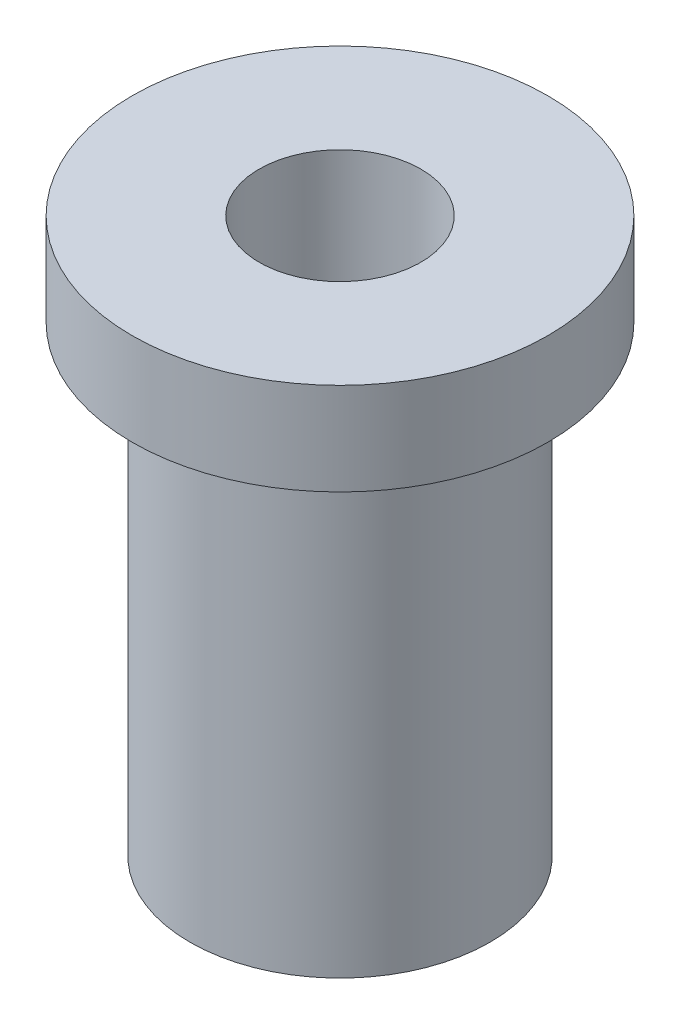
ISO-10303-21;
HEADER;
FILE_DESCRIPTION(('STEP AP214'),'2;1');
FILE_NAME('part.step','',(''),(''),'','','');
FILE_SCHEMA(('AUTOMOTIVE_DESIGN { 1 0 10303 214 1 1 1 1 }'));
ENDSEC;
DATA;
#1=APPLICATION_CONTEXT('core data for automotive mechanical design processes');
#2=APPLICATION_PROTOCOL_DEFINITION('international standard','automotive_design',2000,#1);
#3=PRODUCT_CONTEXT('',#1,'mechanical');
#4=PRODUCT('Part','Part','',(#3));
#5=PRODUCT_RELATED_PRODUCT_CATEGORY('part','',(#4));
#6=PRODUCT_DEFINITION_FORMATION('','',#4);
#7=PRODUCT_DEFINITION_CONTEXT('part definition',#1,'design');
#8=PRODUCT_DEFINITION('design','',#6,#7);
#9=PRODUCT_DEFINITION_SHAPE('','',#8);
#10=(LENGTH_UNIT() NAMED_UNIT(*) SI_UNIT(.MILLI.,.METRE.));
#11=(NAMED_UNIT(*) PLANE_ANGLE_UNIT() SI_UNIT($,.RADIAN.));
#12=(NAMED_UNIT(*) SI_UNIT($,.STERADIAN.) SOLID_ANGLE_UNIT());
#13=UNCERTAINTY_MEASURE_WITH_UNIT(LENGTH_MEASURE(1.E-05),#10,'distance_accuracy_value','');
#14=(GEOMETRIC_REPRESENTATION_CONTEXT(3) GLOBAL_UNCERTAINTY_ASSIGNED_CONTEXT((#13)) GLOBAL_UNIT_ASSIGNED_CONTEXT((#10,
#11,#12)) REPRESENTATION_CONTEXT('',''));
#15=CARTESIAN_POINT('',(0.,0.,0.));
#16=DIRECTION('',(0.,0.,1.));
#17=DIRECTION('',(1.,0.,0.));
#18=AXIS2_PLACEMENT_3D('',#15,#16,#17);
#19=CARTESIAN_POINT('',(0.,12.,0.));
#20=DIRECTION('',(0.,-1.,0.));
#21=DIRECTION('',(0.,0.,-1.));
#22=AXIS2_PLACEMENT_3D('',#19,#20,#21);
#23=CYLINDRICAL_SURFACE('',#22,4.5);
#24=CARTESIAN_POINT('',(0.,12.,0.));
#25=DIRECTION('',(0.,1.,0.));
#26=DIRECTION('',(0.,0.,1.));
#27=AXIS2_PLACEMENT_3D('',#24,#25,#26);
#28=CIRCLE('',#27,4.5);
#29=CARTESIAN_POINT('',(0.,12.,4.5));
#30=VERTEX_POINT('',#29);
#31=EDGE_CURVE('E10',#30,#30,#28,.T.);
#32=ORIENTED_EDGE('',*,*,#31,.F.);
#33=EDGE_LOOP('',(#32));
#34=FACE_BOUND('',#33,.T.);
#35=CARTESIAN_POINT('',(0.,10.,0.));
#36=DIRECTION('',(0.,-1.,0.));
#37=DIRECTION('',(0.,0.,-1.));
#38=AXIS2_PLACEMENT_3D('',#35,#36,#37);
#39=CIRCLE('',#38,4.5);
#40=CARTESIAN_POINT('',(0.,10.,-4.5));
#41=VERTEX_POINT('',#40);
#42=EDGE_CURVE('E37',#41,#41,#39,.T.);
#43=ORIENTED_EDGE('',*,*,#42,.F.);
#44=EDGE_LOOP('',(#43));
#45=FACE_BOUND('',#44,.T.);
#46=ADVANCED_FACE('F31',(#34,#45),#23,.T.);
#47=CARTESIAN_POINT('',(0.,12.,0.));
#48=DIRECTION('',(0.,1.,0.));
#49=DIRECTION('',(0.,0.,1.));
#50=AXIS2_PLACEMENT_3D('',#47,#48,#49);
#51=PLANE('',#50);
#52=CARTESIAN_POINT('',(0.,12.,0.));
#53=DIRECTION('',(0.,-1.,0.));
#54=DIRECTION('',(0.,0.,-1.));
#55=AXIS2_PLACEMENT_3D('',#52,#53,#54);
#56=CIRCLE('',#55,1.75);
#57=CARTESIAN_POINT('',(0.,12.,-1.75));
#58=VERTEX_POINT('',#57);
#59=EDGE_CURVE('E49',#58,#58,#56,.T.);
#60=ORIENTED_EDGE('',*,*,#59,.T.);
#61=EDGE_LOOP('',(#60));
#62=FACE_BOUND('',#61,.T.);
#63=ORIENTED_EDGE('',*,*,#31,.T.);
#64=EDGE_LOOP('',(#63));
#65=FACE_BOUND('',#64,.T.);
#66=ADVANCED_FACE('F57',(#62,#65),#51,.T.);
#67=CARTESIAN_POINT('',(0.,10.,0.));
#68=DIRECTION('',(0.,-1.,0.));
#69=DIRECTION('',(0.,0.,-1.));
#70=AXIS2_PLACEMENT_3D('',#67,#68,#69);
#71=PLANE('',#70);
#72=CARTESIAN_POINT('',(0.,10.,0.));
#73=DIRECTION('',(0.,-1.,0.));
#74=DIRECTION('',(0.,0.,-1.));
#75=AXIS2_PLACEMENT_3D('',#72,#73,#74);
#76=CIRCLE('',#75,3.25);
#77=CARTESIAN_POINT('',(0.,10.,-3.25));
#78=VERTEX_POINT('',#77);
#79=EDGE_CURVE('E41',#78,#78,#76,.T.);
#80=ORIENTED_EDGE('',*,*,#79,.F.);
#81=EDGE_LOOP('',(#80));
#82=FACE_BOUND('',#81,.T.);
#83=ORIENTED_EDGE('',*,*,#42,.T.);
#84=EDGE_LOOP('',(#83));
#85=FACE_BOUND('',#84,.T.);
#86=ADVANCED_FACE('F72',(#82,#85),#71,.T.);
#87=CARTESIAN_POINT('',(0.,10.,0.));
#88=DIRECTION('',(0.,-1.,0.));
#89=DIRECTION('',(0.,0.,-1.));
#90=AXIS2_PLACEMENT_3D('',#87,#88,#89);
#91=CYLINDRICAL_SURFACE('',#90,3.25);
#92=ORIENTED_EDGE('',*,*,#79,.T.);
#93=EDGE_LOOP('',(#92));
#94=FACE_BOUND('',#93,.T.);
#95=CARTESIAN_POINT('',(0.,0.,0.));
#96=DIRECTION('',(0.,-1.,0.));
#97=DIRECTION('',(0.,0.,-1.));
#98=AXIS2_PLACEMENT_3D('',#95,#96,#97);
#99=CIRCLE('',#98,3.25);
#100=CARTESIAN_POINT('',(0.,0.,-3.25));
#101=VERTEX_POINT('',#100);
#102=EDGE_CURVE('E45',#101,#101,#99,.T.);
#103=ORIENTED_EDGE('',*,*,#102,.F.);
#104=EDGE_LOOP('',(#103));
#105=FACE_BOUND('',#104,.T.);
#106=ADVANCED_FACE('F68',(#94,#105),#91,.T.);
#107=CARTESIAN_POINT('',(0.,0.,0.));
#108=DIRECTION('',(0.,1.,0.));
#109=DIRECTION('',(0.,0.,1.));
#110=AXIS2_PLACEMENT_3D('',#107,#108,#109);
#111=PLANE('',#110);
#112=CARTESIAN_POINT('',(0.,0.,0.));
#113=DIRECTION('',(0.,-1.,0.));
#114=DIRECTION('',(0.,0.,-1.));
#115=AXIS2_PLACEMENT_3D('',#112,#113,#114);
#116=CIRCLE('',#115,1.75);
#117=CARTESIAN_POINT('',(0.,0.,-1.75));
#118=VERTEX_POINT('',#117);
#119=EDGE_CURVE('E51',#118,#118,#116,.T.);
#120=ORIENTED_EDGE('',*,*,#119,.F.);
#121=EDGE_LOOP('',(#120));
#122=FACE_BOUND('',#121,.T.);
#123=ORIENTED_EDGE('',*,*,#102,.T.);
#124=EDGE_LOOP('',(#123));
#125=FACE_BOUND('',#124,.T.);
#126=ADVANCED_FACE('F62',(#122,#125),#111,.F.);
#127=CARTESIAN_POINT('',(0.,12.,0.));
#128=DIRECTION('',(0.,-1.,0.));
#129=DIRECTION('',(0.,0.,-1.));
#130=AXIS2_PLACEMENT_3D('',#127,#128,#129);
#131=CYLINDRICAL_SURFACE('',#130,1.75);
#132=ORIENTED_EDGE('',*,*,#59,.F.);
#133=EDGE_LOOP('',(#132));
#134=FACE_BOUND('',#133,.T.);
#135=ORIENTED_EDGE('',*,*,#119,.T.);
#136=EDGE_LOOP('',(#135));
#137=FACE_BOUND('',#136,.T.);
#138=ADVANCED_FACE('F59',(#134,#137),#131,.F.);
#139=CLOSED_SHELL('',(#46,#66,#86,#106,#126,#138));
#140=MANIFOLD_SOLID_BREP('B2',#139);
#141=ADVANCED_BREP_SHAPE_REPRESENTATION('',(#18,#140),#14);
#142=SHAPE_DEFINITION_REPRESENTATION(#9,#141);
ENDSEC;
END-ISO-10303-21;
